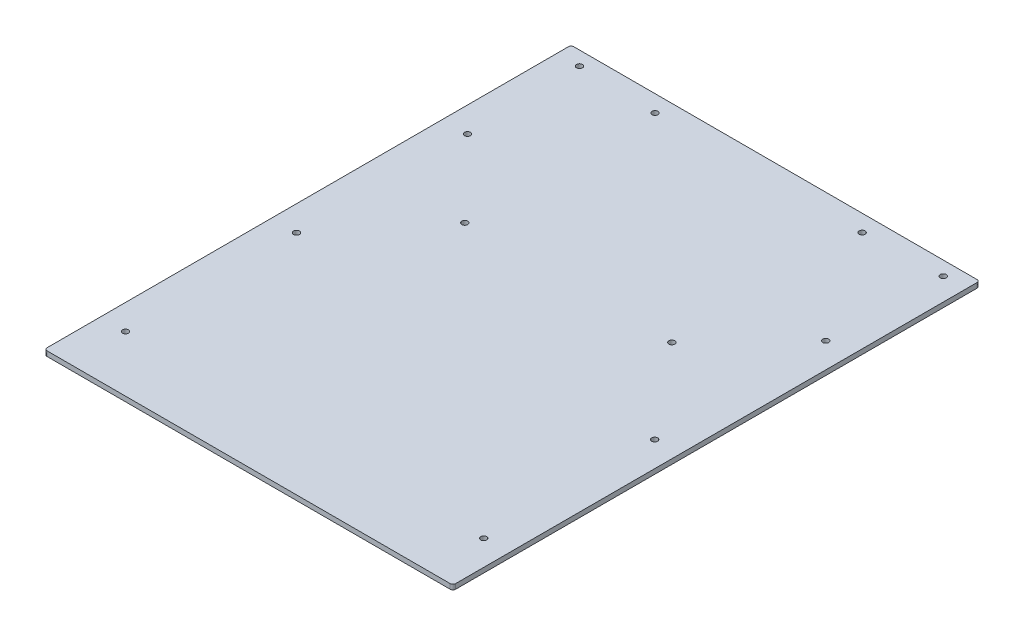
ISO-10303-21;
HEADER;
FILE_DESCRIPTION(('STEP AP214'),'2;1');
FILE_NAME('part.step','',(''),(''),'','','');
FILE_SCHEMA(('AUTOMOTIVE_DESIGN { 1 0 10303 214 1 1 1 1 }'));
ENDSEC;
DATA;
#1=APPLICATION_CONTEXT('core data for automotive mechanical design processes');
#2=APPLICATION_PROTOCOL_DEFINITION('international standard','automotive_design',2000,#1);
#3=PRODUCT_CONTEXT('',#1,'mechanical');
#4=PRODUCT('Part','Part','',(#3));
#5=PRODUCT_RELATED_PRODUCT_CATEGORY('part','',(#4));
#6=PRODUCT_DEFINITION_FORMATION('','',#4);
#7=PRODUCT_DEFINITION_CONTEXT('part definition',#1,'design');
#8=PRODUCT_DEFINITION('design','',#6,#7);
#9=PRODUCT_DEFINITION_SHAPE('','',#8);
#10=(LENGTH_UNIT() NAMED_UNIT(*) SI_UNIT(.MILLI.,.METRE.));
#11=(NAMED_UNIT(*) PLANE_ANGLE_UNIT() SI_UNIT($,.RADIAN.));
#12=(NAMED_UNIT(*) SI_UNIT($,.STERADIAN.) SOLID_ANGLE_UNIT());
#13=UNCERTAINTY_MEASURE_WITH_UNIT(LENGTH_MEASURE(1.E-05),#10,'distance_accuracy_value','');
#14=(GEOMETRIC_REPRESENTATION_CONTEXT(3) GLOBAL_UNCERTAINTY_ASSIGNED_CONTEXT((#13)) GLOBAL_UNIT_ASSIGNED_CONTEXT((#10,
#11,#12)) REPRESENTATION_CONTEXT('',''));
#15=CARTESIAN_POINT('',(0.,0.,0.));
#16=DIRECTION('',(0.,0.,1.));
#17=DIRECTION('',(1.,0.,0.));
#18=AXIS2_PLACEMENT_3D('',#15,#16,#17);
#19=CARTESIAN_POINT('',(0.,5.588,0.));
#20=DIRECTION('',(0.,-1.,0.));
#21=DIRECTION('',(0.,0.,-1.));
#22=AXIS2_PLACEMENT_3D('',#19,#20,#21);
#23=PLANE('',#22);
#24=CARTESIAN_POINT('',(349.25,5.588,-578.612));
#25=DIRECTION('',(0.,1.,0.));
#26=DIRECTION('',(0.,0.,1.));
#27=AXIS2_PLACEMENT_3D('',#24,#25,#26);
#28=CIRCLE('',#27,3.37819999999999);
#29=CARTESIAN_POINT('',(349.25,5.588,-575.2338));
#30=VERTEX_POINT('',#29);
#31=EDGE_CURVE('E243',#30,#30,#28,.T.);
#32=ORIENTED_EDGE('',*,*,#31,.F.);
#33=EDGE_LOOP('',(#32));
#34=FACE_BOUND('',#33,.T.);
#35=CARTESIAN_POINT('',(114.3,5.588,-362.712));
#36=DIRECTION('',(0.,1.,0.));
#37=DIRECTION('',(0.,0.,1.));
#38=AXIS2_PLACEMENT_3D('',#35,#36,#37);
#39=CIRCLE('',#38,3.37819999999999);
#40=CARTESIAN_POINT('',(114.3,5.588,-359.3338));
#41=VERTEX_POINT('',#40);
#42=EDGE_CURVE('E236',#41,#41,#39,.T.);
#43=ORIENTED_EDGE('',*,*,#42,.F.);
#44=EDGE_LOOP('',(#43));
#45=FACE_BOUND('',#44,.T.);
#46=CARTESIAN_POINT('',(349.25,5.588,-362.712));
#47=DIRECTION('',(0.,1.,0.));
#48=DIRECTION('',(0.,0.,1.));
#49=AXIS2_PLACEMENT_3D('',#46,#47,#48);
#50=CIRCLE('',#49,3.37819999999999);
#51=CARTESIAN_POINT('',(349.25,5.588,-359.3338));
#52=VERTEX_POINT('',#51);
#53=EDGE_CURVE('E248',#52,#52,#50,.T.);
#54=ORIENTED_EDGE('',*,*,#53,.F.);
#55=EDGE_LOOP('',(#54));
#56=FACE_BOUND('',#55,.T.);
#57=CARTESIAN_POINT('',(114.3,5.588,-578.612));
#58=DIRECTION('',(0.,1.,0.));
#59=DIRECTION('',(0.,0.,1.));
#60=AXIS2_PLACEMENT_3D('',#57,#58,#59);
#61=CIRCLE('',#60,3.37819999999999);
#62=CARTESIAN_POINT('',(114.3,5.588,-575.2338));
#63=VERTEX_POINT('',#62);
#64=EDGE_CURVE('E230',#63,#63,#61,.T.);
#65=ORIENTED_EDGE('',*,*,#64,.F.);
#66=EDGE_LOOP('',(#65));
#67=FACE_BOUND('',#66,.T.);
#68=CARTESIAN_POINT('',(25.4,5.588,-581.787));
#69=DIRECTION('',(0.,1.,0.));
#70=DIRECTION('',(0.,0.,1.));
#71=AXIS2_PLACEMENT_3D('',#68,#69,#70);
#72=CIRCLE('',#71,3.37819999999999);
#73=CARTESIAN_POINT('',(25.4,5.588,-578.4088));
#74=VERTEX_POINT('',#73);
#75=EDGE_CURVE('E225',#74,#74,#72,.T.);
#76=ORIENTED_EDGE('',*,*,#75,.F.);
#77=EDGE_LOOP('',(#76));
#78=FACE_BOUND('',#77,.T.);
#79=CARTESIAN_POINT('',(438.15,5.588,-581.787));
#80=DIRECTION('',(0.,1.,0.));
#81=DIRECTION('',(0.,0.,-1.));
#82=AXIS2_PLACEMENT_3D('',#79,#80,#81);
#83=CIRCLE('',#82,3.37819999999999);
#84=CARTESIAN_POINT('',(438.15,5.588,-585.1652));
#85=VERTEX_POINT('',#84);
#86=EDGE_CURVE('E218',#85,#85,#83,.T.);
#87=ORIENTED_EDGE('',*,*,#86,.F.);
#88=EDGE_LOOP('',(#87));
#89=FACE_BOUND('',#88,.T.);
#90=DIRECTION('',(-1.,0.,0.));
#91=VECTOR('',#90,1.);
#92=CARTESIAN_POINT('',(0.,5.588,-597.662));
#93=LINE('',#92,#91);
#94=CARTESIAN_POINT('',(460.375,5.588,-597.662));
#95=VERTEX_POINT('',#94);
#96=CARTESIAN_POINT('',(3.175,5.588,-597.662));
#97=VERTEX_POINT('',#96);
#98=EDGE_CURVE('E138',#95,#97,#93,.T.);
#99=ORIENTED_EDGE('',*,*,#98,.T.);
#100=CARTESIAN_POINT('',(3.175,5.588,-594.487));
#101=DIRECTION('',(0.,-1.,0.));
#102=DIRECTION('',(0.,0.,-1.));
#103=AXIS2_PLACEMENT_3D('',#100,#101,#102);
#104=CIRCLE('',#103,3.175);
#105=CARTESIAN_POINT('',(0.,5.588,-594.487));
#106=VERTEX_POINT('',#105);
#107=EDGE_CURVE('E156',#97,#106,#104,.F.);
#108=ORIENTED_EDGE('',*,*,#107,.T.);
#109=DIRECTION('',(0.,0.,1.));
#110=VECTOR('',#109,1.);
#111=CARTESIAN_POINT('',(0.,5.588,0.));
#112=LINE('',#111,#110);
#113=CARTESIAN_POINT('',(0.,5.588,-3.175));
#114=VERTEX_POINT('',#113);
#115=EDGE_CURVE('E120',#106,#114,#112,.T.);
#116=ORIENTED_EDGE('',*,*,#115,.T.);
#117=CARTESIAN_POINT('',(3.175,5.588,-3.175));
#118=DIRECTION('',(0.,-1.,0.));
#119=DIRECTION('',(0.,0.,-1.));
#120=AXIS2_PLACEMENT_3D('',#117,#118,#119);
#121=CIRCLE('',#120,3.175);
#122=CARTESIAN_POINT('',(3.175,5.588,0.));
#123=VERTEX_POINT('',#122);
#124=EDGE_CURVE('E152',#114,#123,#121,.F.);
#125=ORIENTED_EDGE('',*,*,#124,.T.);
#126=DIRECTION('',(1.,0.,0.));
#127=VECTOR('',#126,1.);
#128=CARTESIAN_POINT('',(0.,5.588,0.));
#129=LINE('',#128,#127);
#130=CARTESIAN_POINT('',(460.375,5.588,0.));
#131=VERTEX_POINT('',#130);
#132=EDGE_CURVE('E165',#123,#131,#129,.T.);
#133=ORIENTED_EDGE('',*,*,#132,.T.);
#134=CARTESIAN_POINT('',(460.375,5.588,-3.175));
#135=DIRECTION('',(0.,-1.,0.));
#136=DIRECTION('',(0.,0.,-1.));
#137=AXIS2_PLACEMENT_3D('',#134,#135,#136);
#138=CIRCLE('',#137,3.175);
#139=CARTESIAN_POINT('',(463.55,5.588,-3.175));
#140=VERTEX_POINT('',#139);
#141=EDGE_CURVE('E55',#131,#140,#138,.F.);
#142=ORIENTED_EDGE('',*,*,#141,.T.);
#143=DIRECTION('',(0.,0.,-1.));
#144=VECTOR('',#143,1.);
#145=CARTESIAN_POINT('',(463.55,5.588,0.));
#146=LINE('',#145,#144);
#147=CARTESIAN_POINT('',(463.55,5.588,-594.487));
#148=VERTEX_POINT('',#147);
#149=EDGE_CURVE('E171',#140,#148,#146,.T.);
#150=ORIENTED_EDGE('',*,*,#149,.T.);
#151=CARTESIAN_POINT('',(460.375,5.588,-594.487));
#152=DIRECTION('',(0.,-1.,0.));
#153=DIRECTION('',(0.,0.,-1.));
#154=AXIS2_PLACEMENT_3D('',#151,#152,#153);
#155=CIRCLE('',#154,3.175);
#156=EDGE_CURVE('E154',#148,#95,#155,.F.);
#157=ORIENTED_EDGE('',*,*,#156,.T.);
#158=EDGE_LOOP('',(#99,#108,#116,#125,#133,#142,#150,#157));
#159=FACE_BOUND('',#158,.T.);
#160=CARTESIAN_POINT('',(28.575,5.588,-63.5));
#161=DIRECTION('',(0.,1.,0.));
#162=DIRECTION('',(0.,0.,1.));
#163=AXIS2_PLACEMENT_3D('',#160,#161,#162);
#164=CIRCLE('',#163,3.37820000000001);
#165=CARTESIAN_POINT('',(28.575,5.588,-60.1218));
#166=VERTEX_POINT('',#165);
#167=EDGE_CURVE('E129',#166,#166,#164,.T.);
#168=ORIENTED_EDGE('',*,*,#167,.F.);
#169=EDGE_LOOP('',(#168));
#170=FACE_BOUND('',#169,.T.);
#171=CARTESIAN_POINT('',(28.575,5.588,-257.556));
#172=DIRECTION('',(0.,1.,0.));
#173=DIRECTION('',(0.,0.,1.));
#174=AXIS2_PLACEMENT_3D('',#171,#172,#173);
#175=CIRCLE('',#174,3.37819999999999);
#176=CARTESIAN_POINT('',(28.575,5.588,-254.1778));
#177=VERTEX_POINT('',#176);
#178=EDGE_CURVE('E186',#177,#177,#175,.T.);
#179=ORIENTED_EDGE('',*,*,#178,.F.);
#180=EDGE_LOOP('',(#179));
#181=FACE_BOUND('',#180,.T.);
#182=CARTESIAN_POINT('',(28.575,5.588,-451.612));
#183=DIRECTION('',(0.,1.,0.));
#184=DIRECTION('',(0.,0.,1.));
#185=AXIS2_PLACEMENT_3D('',#182,#183,#184);
#186=CIRCLE('',#185,3.37819999999999);
#187=CARTESIAN_POINT('',(28.575,5.588,-448.2338));
#188=VERTEX_POINT('',#187);
#189=EDGE_CURVE('E191',#188,#188,#186,.T.);
#190=ORIENTED_EDGE('',*,*,#189,.F.);
#191=EDGE_LOOP('',(#190));
#192=FACE_BOUND('',#191,.T.);
#193=CARTESIAN_POINT('',(434.975,5.588,-451.612));
#194=DIRECTION('',(0.,1.,0.));
#195=DIRECTION('',(0.,0.,-1.));
#196=AXIS2_PLACEMENT_3D('',#193,#194,#195);
#197=CIRCLE('',#196,3.37819999999999);
#198=CARTESIAN_POINT('',(434.975,5.588,-454.9902));
#199=VERTEX_POINT('',#198);
#200=EDGE_CURVE('E197',#199,#199,#197,.T.);
#201=ORIENTED_EDGE('',*,*,#200,.F.);
#202=EDGE_LOOP('',(#201));
#203=FACE_BOUND('',#202,.T.);
#204=CARTESIAN_POINT('',(434.975,5.588,-257.556));
#205=DIRECTION('',(0.,1.,0.));
#206=DIRECTION('',(0.,0.,-1.));
#207=AXIS2_PLACEMENT_3D('',#204,#205,#206);
#208=CIRCLE('',#207,3.37819999999999);
#209=CARTESIAN_POINT('',(434.975,5.588,-260.9342));
#210=VERTEX_POINT('',#209);
#211=EDGE_CURVE('E203',#210,#210,#208,.T.);
#212=ORIENTED_EDGE('',*,*,#211,.F.);
#213=EDGE_LOOP('',(#212));
#214=FACE_BOUND('',#213,.T.);
#215=CARTESIAN_POINT('',(434.975,5.588,-63.5000000000001));
#216=DIRECTION('',(0.,1.,0.));
#217=DIRECTION('',(0.,0.,-1.));
#218=AXIS2_PLACEMENT_3D('',#215,#216,#217);
#219=CIRCLE('',#218,3.37819999999999);
#220=CARTESIAN_POINT('',(434.975,5.588,-66.8782));
#221=VERTEX_POINT('',#220);
#222=EDGE_CURVE('E209',#221,#221,#219,.T.);
#223=ORIENTED_EDGE('',*,*,#222,.F.);
#224=EDGE_LOOP('',(#223));
#225=FACE_BOUND('',#224,.T.);
#226=ADVANCED_FACE('F33',(#34,#45,#56,#67,#78,#89,#159,#170,#181,#192,#203,#214,#225),#23,.F.);
#227=CARTESIAN_POINT('',(0.,0.,0.));
#228=DIRECTION('',(0.,-1.,0.));
#229=DIRECTION('',(0.,0.,-1.));
#230=AXIS2_PLACEMENT_3D('',#227,#228,#229);
#231=PLANE('',#230);
#232=CARTESIAN_POINT('',(349.25,0.,-578.612));
#233=DIRECTION('',(0.,1.,0.));
#234=DIRECTION('',(0.,0.,1.));
#235=AXIS2_PLACEMENT_3D('',#232,#233,#234);
#236=CIRCLE('',#235,3.37819999999999);
#237=CARTESIAN_POINT('',(349.25,0.,-575.2338));
#238=VERTEX_POINT('',#237);
#239=EDGE_CURVE('E233',#238,#238,#236,.T.);
#240=ORIENTED_EDGE('',*,*,#239,.T.);
#241=EDGE_LOOP('',(#240));
#242=FACE_BOUND('',#241,.T.);
#243=CARTESIAN_POINT('',(114.3,0.,-362.712));
#244=DIRECTION('',(0.,1.,0.));
#245=DIRECTION('',(0.,0.,1.));
#246=AXIS2_PLACEMENT_3D('',#243,#244,#245);
#247=CIRCLE('',#246,3.37819999999999);
#248=CARTESIAN_POINT('',(114.3,0.,-359.3338));
#249=VERTEX_POINT('',#248);
#250=EDGE_CURVE('E239',#249,#249,#247,.T.);
#251=ORIENTED_EDGE('',*,*,#250,.T.);
#252=EDGE_LOOP('',(#251));
#253=FACE_BOUND('',#252,.T.);
#254=CARTESIAN_POINT('',(349.25,0.,-362.712));
#255=DIRECTION('',(0.,1.,0.));
#256=DIRECTION('',(0.,0.,1.));
#257=AXIS2_PLACEMENT_3D('',#254,#255,#256);
#258=CIRCLE('',#257,3.37819999999999);
#259=CARTESIAN_POINT('',(349.25,0.,-359.3338));
#260=VERTEX_POINT('',#259);
#261=EDGE_CURVE('E240',#260,#260,#258,.T.);
#262=ORIENTED_EDGE('',*,*,#261,.T.);
#263=EDGE_LOOP('',(#262));
#264=FACE_BOUND('',#263,.T.);
#265=CARTESIAN_POINT('',(114.3,0.,-578.612));
#266=DIRECTION('',(0.,1.,0.));
#267=DIRECTION('',(0.,0.,1.));
#268=AXIS2_PLACEMENT_3D('',#265,#266,#267);
#269=CIRCLE('',#268,3.37819999999999);
#270=CARTESIAN_POINT('',(114.3,0.,-575.2338));
#271=VERTEX_POINT('',#270);
#272=EDGE_CURVE('E222',#271,#271,#269,.T.);
#273=ORIENTED_EDGE('',*,*,#272,.T.);
#274=EDGE_LOOP('',(#273));
#275=FACE_BOUND('',#274,.T.);
#276=CARTESIAN_POINT('',(25.4,0.,-581.787));
#277=DIRECTION('',(0.,1.,0.));
#278=DIRECTION('',(0.,0.,1.));
#279=AXIS2_PLACEMENT_3D('',#276,#277,#278);
#280=CIRCLE('',#279,3.37819999999999);
#281=CARTESIAN_POINT('',(25.4,0.,-578.4088));
#282=VERTEX_POINT('',#281);
#283=EDGE_CURVE('E215',#282,#282,#280,.T.);
#284=ORIENTED_EDGE('',*,*,#283,.T.);
#285=EDGE_LOOP('',(#284));
#286=FACE_BOUND('',#285,.T.);
#287=CARTESIAN_POINT('',(438.15,0.,-581.787));
#288=DIRECTION('',(0.,1.,0.));
#289=DIRECTION('',(0.,0.,-1.));
#290=AXIS2_PLACEMENT_3D('',#287,#288,#289);
#291=CIRCLE('',#290,3.37819999999999);
#292=CARTESIAN_POINT('',(438.15,0.,-585.1652));
#293=VERTEX_POINT('',#292);
#294=EDGE_CURVE('E221',#293,#293,#291,.T.);
#295=ORIENTED_EDGE('',*,*,#294,.T.);
#296=EDGE_LOOP('',(#295));
#297=FACE_BOUND('',#296,.T.);
#298=CARTESIAN_POINT('',(434.975,0.,-257.556));
#299=DIRECTION('',(0.,1.,0.));
#300=DIRECTION('',(0.,0.,-1.));
#301=AXIS2_PLACEMENT_3D('',#298,#299,#300);
#302=CIRCLE('',#301,3.37819999999999);
#303=CARTESIAN_POINT('',(434.975,0.,-260.9342));
#304=VERTEX_POINT('',#303);
#305=EDGE_CURVE('E206',#304,#304,#302,.T.);
#306=ORIENTED_EDGE('',*,*,#305,.T.);
#307=EDGE_LOOP('',(#306));
#308=FACE_BOUND('',#307,.T.);
#309=CARTESIAN_POINT('',(28.575,0.,-451.612));
#310=DIRECTION('',(0.,1.,0.));
#311=DIRECTION('',(0.,0.,1.));
#312=AXIS2_PLACEMENT_3D('',#309,#310,#311);
#313=CIRCLE('',#312,3.37819999999999);
#314=CARTESIAN_POINT('',(28.575,0.,-448.2338));
#315=VERTEX_POINT('',#314);
#316=EDGE_CURVE('E194',#315,#315,#313,.T.);
#317=ORIENTED_EDGE('',*,*,#316,.T.);
#318=EDGE_LOOP('',(#317));
#319=FACE_BOUND('',#318,.T.);
#320=CARTESIAN_POINT('',(28.575,0.,-63.5));
#321=DIRECTION('',(0.,1.,0.));
#322=DIRECTION('',(0.,0.,1.));
#323=AXIS2_PLACEMENT_3D('',#320,#321,#322);
#324=CIRCLE('',#323,3.37820000000001);
#325=CARTESIAN_POINT('',(28.575,0.,-60.1218));
#326=VERTEX_POINT('',#325);
#327=EDGE_CURVE('E135',#326,#326,#324,.T.);
#328=ORIENTED_EDGE('',*,*,#327,.T.);
#329=EDGE_LOOP('',(#328));
#330=FACE_BOUND('',#329,.T.);
#331=DIRECTION('',(0.,0.,1.));
#332=VECTOR('',#331,1.);
#333=CARTESIAN_POINT('',(0.,0.,0.));
#334=LINE('',#333,#332);
#335=CARTESIAN_POINT('',(0.,0.,-594.487));
#336=VERTEX_POINT('',#335);
#337=CARTESIAN_POINT('',(0.,0.,-3.175));
#338=VERTEX_POINT('',#337);
#339=EDGE_CURVE('E117',#336,#338,#334,.T.);
#340=ORIENTED_EDGE('',*,*,#339,.F.);
#341=CARTESIAN_POINT('',(3.175,0.,-594.487));
#342=DIRECTION('',(0.,-1.,0.));
#343=DIRECTION('',(0.,0.,-1.));
#344=AXIS2_PLACEMENT_3D('',#341,#342,#343);
#345=CIRCLE('',#344,3.175);
#346=CARTESIAN_POINT('',(3.175,0.,-597.662));
#347=VERTEX_POINT('',#346);
#348=EDGE_CURVE('E100',#336,#347,#345,.T.);
#349=ORIENTED_EDGE('',*,*,#348,.T.);
#350=DIRECTION('',(-1.,0.,0.));
#351=VECTOR('',#350,1.);
#352=CARTESIAN_POINT('',(0.,0.,-597.662));
#353=LINE('',#352,#351);
#354=CARTESIAN_POINT('',(460.375,0.,-597.662));
#355=VERTEX_POINT('',#354);
#356=EDGE_CURVE('E142',#355,#347,#353,.T.);
#357=ORIENTED_EDGE('',*,*,#356,.F.);
#358=CARTESIAN_POINT('',(460.375,0.,-594.487));
#359=DIRECTION('',(0.,-1.,0.));
#360=DIRECTION('',(0.,0.,-1.));
#361=AXIS2_PLACEMENT_3D('',#358,#359,#360);
#362=CIRCLE('',#361,3.175);
#363=CARTESIAN_POINT('',(463.55,0.,-594.487));
#364=VERTEX_POINT('',#363);
#365=EDGE_CURVE('E111',#355,#364,#362,.T.);
#366=ORIENTED_EDGE('',*,*,#365,.T.);
#367=DIRECTION('',(0.,0.,-1.));
#368=VECTOR('',#367,1.);
#369=CARTESIAN_POINT('',(463.55,0.,0.));
#370=LINE('',#369,#368);
#371=CARTESIAN_POINT('',(463.55,0.,-3.175));
#372=VERTEX_POINT('',#371);
#373=EDGE_CURVE('E132',#372,#364,#370,.T.);
#374=ORIENTED_EDGE('',*,*,#373,.F.);
#375=CARTESIAN_POINT('',(460.375,0.,-3.175));
#376=DIRECTION('',(0.,-1.,0.));
#377=DIRECTION('',(0.,0.,-1.));
#378=AXIS2_PLACEMENT_3D('',#375,#376,#377);
#379=CIRCLE('',#378,3.175);
#380=CARTESIAN_POINT('',(460.375,0.,0.));
#381=VERTEX_POINT('',#380);
#382=EDGE_CURVE('E121',#372,#381,#379,.T.);
#383=ORIENTED_EDGE('',*,*,#382,.T.);
#384=DIRECTION('',(1.,0.,0.));
#385=VECTOR('',#384,1.);
#386=CARTESIAN_POINT('',(0.,0.,0.));
#387=LINE('',#386,#385);
#388=CARTESIAN_POINT('',(3.175,0.,0.));
#389=VERTEX_POINT('',#388);
#390=EDGE_CURVE('E128',#389,#381,#387,.T.);
#391=ORIENTED_EDGE('',*,*,#390,.F.);
#392=CARTESIAN_POINT('',(3.175,0.,-3.175));
#393=DIRECTION('',(0.,-1.,0.));
#394=DIRECTION('',(0.,0.,-1.));
#395=AXIS2_PLACEMENT_3D('',#392,#393,#394);
#396=CIRCLE('',#395,3.175);
#397=EDGE_CURVE('E127',#389,#338,#396,.T.);
#398=ORIENTED_EDGE('',*,*,#397,.T.);
#399=EDGE_LOOP('',(#340,#349,#357,#366,#374,#383,#391,#398));
#400=FACE_BOUND('',#399,.T.);
#401=CARTESIAN_POINT('',(28.575,0.,-257.556));
#402=DIRECTION('',(0.,1.,0.));
#403=DIRECTION('',(0.,0.,1.));
#404=AXIS2_PLACEMENT_3D('',#401,#402,#403);
#405=CIRCLE('',#404,3.37819999999999);
#406=CARTESIAN_POINT('',(28.575,0.,-254.1778));
#407=VERTEX_POINT('',#406);
#408=EDGE_CURVE('E188',#407,#407,#405,.T.);
#409=ORIENTED_EDGE('',*,*,#408,.T.);
#410=EDGE_LOOP('',(#409));
#411=FACE_BOUND('',#410,.T.);
#412=CARTESIAN_POINT('',(434.975,0.,-451.612));
#413=DIRECTION('',(0.,1.,0.));
#414=DIRECTION('',(0.,0.,-1.));
#415=AXIS2_PLACEMENT_3D('',#412,#413,#414);
#416=CIRCLE('',#415,3.37819999999999);
#417=CARTESIAN_POINT('',(434.975,0.,-454.9902));
#418=VERTEX_POINT('',#417);
#419=EDGE_CURVE('E200',#418,#418,#416,.T.);
#420=ORIENTED_EDGE('',*,*,#419,.T.);
#421=EDGE_LOOP('',(#420));
#422=FACE_BOUND('',#421,.T.);
#423=CARTESIAN_POINT('',(434.975,0.,-63.5000000000001));
#424=DIRECTION('',(0.,1.,0.));
#425=DIRECTION('',(0.,0.,-1.));
#426=AXIS2_PLACEMENT_3D('',#423,#424,#425);
#427=CIRCLE('',#426,3.37819999999999);
#428=CARTESIAN_POINT('',(434.975,0.,-66.8782));
#429=VERTEX_POINT('',#428);
#430=EDGE_CURVE('E212',#429,#429,#427,.T.);
#431=ORIENTED_EDGE('',*,*,#430,.T.);
#432=EDGE_LOOP('',(#431));
#433=FACE_BOUND('',#432,.T.);
#434=ADVANCED_FACE('F124',(#242,#253,#264,#275,#286,#297,#308,#319,#330,#400,#411,#422,#433),
#231,.T.);
#435=CARTESIAN_POINT('',(0.,5.588,0.));
#436=DIRECTION('',(1.,0.,0.));
#437=DIRECTION('',(0.,0.,-1.));
#438=AXIS2_PLACEMENT_3D('',#435,#436,#437);
#439=PLANE('',#438);
#440=ORIENTED_EDGE('',*,*,#115,.F.);
#441=DIRECTION('',(0.,-1.,0.));
#442=VECTOR('',#441,1.);
#443=CARTESIAN_POINT('',(0.,5.588,-594.487));
#444=LINE('',#443,#442);
#445=EDGE_CURVE('E104',#106,#336,#444,.T.);
#446=ORIENTED_EDGE('',*,*,#445,.T.);
#447=ORIENTED_EDGE('',*,*,#339,.T.);
#448=DIRECTION('',(0.,-1.,0.));
#449=VECTOR('',#448,1.);
#450=CARTESIAN_POINT('',(0.,5.588,-3.175));
#451=LINE('',#450,#449);
#452=EDGE_CURVE('E122',#338,#114,#451,.F.);
#453=ORIENTED_EDGE('',*,*,#452,.T.);
#454=EDGE_LOOP('',(#440,#446,#447,#453));
#455=FACE_BOUND('',#454,.T.);
#456=ADVANCED_FACE('F116',(#455),#439,.F.);
#457=CARTESIAN_POINT('',(0.,5.588,0.));
#458=DIRECTION('',(0.,0.,-1.));
#459=DIRECTION('',(-1.,0.,0.));
#460=AXIS2_PLACEMENT_3D('',#457,#458,#459);
#461=PLANE('',#460);
#462=ORIENTED_EDGE('',*,*,#132,.F.);
#463=DIRECTION('',(0.,-1.,0.));
#464=VECTOR('',#463,1.);
#465=CARTESIAN_POINT('',(3.175,5.588,0.));
#466=LINE('',#465,#464);
#467=EDGE_CURVE('E11',#123,#389,#466,.T.);
#468=ORIENTED_EDGE('',*,*,#467,.T.);
#469=ORIENTED_EDGE('',*,*,#390,.T.);
#470=DIRECTION('',(0.,-1.,0.));
#471=VECTOR('',#470,1.);
#472=CARTESIAN_POINT('',(460.375,5.588,0.));
#473=LINE('',#472,#471);
#474=EDGE_CURVE('E41',#381,#131,#473,.F.);
#475=ORIENTED_EDGE('',*,*,#474,.T.);
#476=EDGE_LOOP('',(#462,#468,#469,#475));
#477=FACE_BOUND('',#476,.T.);
#478=ADVANCED_FACE('F164',(#477),#461,.F.);
#479=CARTESIAN_POINT('',(463.55,5.588,0.));
#480=DIRECTION('',(-1.,0.,0.));
#481=DIRECTION('',(0.,0.,1.));
#482=AXIS2_PLACEMENT_3D('',#479,#480,#481);
#483=PLANE('',#482);
#484=ORIENTED_EDGE('',*,*,#373,.T.);
#485=DIRECTION('',(0.,-1.,0.));
#486=VECTOR('',#485,1.);
#487=CARTESIAN_POINT('',(463.55,5.588,-594.487));
#488=LINE('',#487,#486);
#489=EDGE_CURVE('E48',#364,#148,#488,.F.);
#490=ORIENTED_EDGE('',*,*,#489,.T.);
#491=ORIENTED_EDGE('',*,*,#149,.F.);
#492=DIRECTION('',(0.,-1.,0.));
#493=VECTOR('',#492,1.);
#494=CARTESIAN_POINT('',(463.55,5.588,-3.175));
#495=LINE('',#494,#493);
#496=EDGE_CURVE('E158',#140,#372,#495,.T.);
#497=ORIENTED_EDGE('',*,*,#496,.T.);
#498=EDGE_LOOP('',(#484,#490,#491,#497));
#499=FACE_BOUND('',#498,.T.);
#500=ADVANCED_FACE('F175',(#499),#483,.F.);
#501=CARTESIAN_POINT('',(0.,5.588,-597.662));
#502=DIRECTION('',(0.,0.,1.));
#503=DIRECTION('',(1.,0.,0.));
#504=AXIS2_PLACEMENT_3D('',#501,#502,#503);
#505=PLANE('',#504);
#506=ORIENTED_EDGE('',*,*,#356,.T.);
#507=DIRECTION('',(0.,-1.,0.));
#508=VECTOR('',#507,1.);
#509=CARTESIAN_POINT('',(3.175,5.588,-597.662));
#510=LINE('',#509,#508);
#511=EDGE_CURVE('E105',#347,#97,#510,.F.);
#512=ORIENTED_EDGE('',*,*,#511,.T.);
#513=ORIENTED_EDGE('',*,*,#98,.F.);
#514=DIRECTION('',(0.,-1.,0.));
#515=VECTOR('',#514,1.);
#516=CARTESIAN_POINT('',(460.375,5.588,-597.662));
#517=LINE('',#516,#515);
#518=EDGE_CURVE('E110',#95,#355,#517,.T.);
#519=ORIENTED_EDGE('',*,*,#518,.T.);
#520=EDGE_LOOP('',(#506,#512,#513,#519));
#521=FACE_BOUND('',#520,.T.);
#522=ADVANCED_FACE('F182',(#521),#505,.F.);
#523=CARTESIAN_POINT('',(28.575,5.588,-63.5));
#524=DIRECTION('',(0.,-1.,0.));
#525=DIRECTION('',(0.,0.,-1.));
#526=AXIS2_PLACEMENT_3D('',#523,#524,#525);
#527=CYLINDRICAL_SURFACE('',#526,3.37820000000001);
#528=ORIENTED_EDGE('',*,*,#167,.T.);
#529=EDGE_LOOP('',(#528));
#530=FACE_BOUND('',#529,.T.);
#531=ORIENTED_EDGE('',*,*,#327,.F.);
#532=EDGE_LOOP('',(#531));
#533=FACE_BOUND('',#532,.T.);
#534=ADVANCED_FACE('F308',(#530,#533),#527,.F.);
#535=CARTESIAN_POINT('',(28.575,5.588,-257.556));
#536=DIRECTION('',(0.,-1.,0.));
#537=DIRECTION('',(0.,0.,-1.));
#538=AXIS2_PLACEMENT_3D('',#535,#536,#537);
#539=CYLINDRICAL_SURFACE('',#538,3.37819999999999);
#540=ORIENTED_EDGE('',*,*,#178,.T.);
#541=EDGE_LOOP('',(#540));
#542=FACE_BOUND('',#541,.T.);
#543=ORIENTED_EDGE('',*,*,#408,.F.);
#544=EDGE_LOOP('',(#543));
#545=FACE_BOUND('',#544,.T.);
#546=ADVANCED_FACE('F304',(#542,#545),#539,.F.);
#547=CARTESIAN_POINT('',(28.575,5.588,-451.612));
#548=DIRECTION('',(0.,-1.,0.));
#549=DIRECTION('',(0.,0.,-1.));
#550=AXIS2_PLACEMENT_3D('',#547,#548,#549);
#551=CYLINDRICAL_SURFACE('',#550,3.37819999999999);
#552=ORIENTED_EDGE('',*,*,#189,.T.);
#553=EDGE_LOOP('',(#552));
#554=FACE_BOUND('',#553,.T.);
#555=ORIENTED_EDGE('',*,*,#316,.F.);
#556=EDGE_LOOP('',(#555));
#557=FACE_BOUND('',#556,.T.);
#558=ADVANCED_FACE('F300',(#554,#557),#551,.F.);
#559=CARTESIAN_POINT('',(434.975,5.588,-451.612));
#560=DIRECTION('',(0.,-1.,0.));
#561=DIRECTION('',(0.,0.,-1.));
#562=AXIS2_PLACEMENT_3D('',#559,#560,#561);
#563=CYLINDRICAL_SURFACE('',#562,3.37819999999999);
#564=ORIENTED_EDGE('',*,*,#200,.T.);
#565=EDGE_LOOP('',(#564));
#566=FACE_BOUND('',#565,.T.);
#567=ORIENTED_EDGE('',*,*,#419,.F.);
#568=EDGE_LOOP('',(#567));
#569=FACE_BOUND('',#568,.T.);
#570=ADVANCED_FACE('F296',(#566,#569),#563,.F.);
#571=CARTESIAN_POINT('',(434.975,5.588,-257.556));
#572=DIRECTION('',(0.,-1.,0.));
#573=DIRECTION('',(0.,0.,-1.));
#574=AXIS2_PLACEMENT_3D('',#571,#572,#573);
#575=CYLINDRICAL_SURFACE('',#574,3.37819999999999);
#576=ORIENTED_EDGE('',*,*,#211,.T.);
#577=EDGE_LOOP('',(#576));
#578=FACE_BOUND('',#577,.T.);
#579=ORIENTED_EDGE('',*,*,#305,.F.);
#580=EDGE_LOOP('',(#579));
#581=FACE_BOUND('',#580,.T.);
#582=ADVANCED_FACE('F292',(#578,#581),#575,.F.);
#583=CARTESIAN_POINT('',(434.975,5.588,-63.5000000000001));
#584=DIRECTION('',(0.,-1.,0.));
#585=DIRECTION('',(0.,0.,-1.));
#586=AXIS2_PLACEMENT_3D('',#583,#584,#585);
#587=CYLINDRICAL_SURFACE('',#586,3.37819999999999);
#588=ORIENTED_EDGE('',*,*,#222,.T.);
#589=EDGE_LOOP('',(#588));
#590=FACE_BOUND('',#589,.T.);
#591=ORIENTED_EDGE('',*,*,#430,.F.);
#592=EDGE_LOOP('',(#591));
#593=FACE_BOUND('',#592,.T.);
#594=ADVANCED_FACE('F289',(#590,#593),#587,.F.);
#595=CARTESIAN_POINT('',(3.175,5.588,-594.487));
#596=DIRECTION('',(0.,-1.,0.));
#597=DIRECTION('',(0.,0.,-1.));
#598=AXIS2_PLACEMENT_3D('',#595,#596,#597);
#599=CYLINDRICAL_SURFACE('',#598,3.175);
#600=ORIENTED_EDGE('',*,*,#107,.F.);
#601=ORIENTED_EDGE('',*,*,#511,.F.);
#602=ORIENTED_EDGE('',*,*,#348,.F.);
#603=ORIENTED_EDGE('',*,*,#445,.F.);
#604=EDGE_LOOP('',(#600,#601,#602,#603));
#605=FACE_BOUND('',#604,.T.);
#606=ADVANCED_FACE('F103',(#605),#599,.T.);
#607=CARTESIAN_POINT('',(460.375,5.588,-594.487));
#608=DIRECTION('',(0.,-1.,0.));
#609=DIRECTION('',(0.,0.,-1.));
#610=AXIS2_PLACEMENT_3D('',#607,#608,#609);
#611=CYLINDRICAL_SURFACE('',#610,3.175);
#612=ORIENTED_EDGE('',*,*,#156,.F.);
#613=ORIENTED_EDGE('',*,*,#489,.F.);
#614=ORIENTED_EDGE('',*,*,#365,.F.);
#615=ORIENTED_EDGE('',*,*,#518,.F.);
#616=EDGE_LOOP('',(#612,#613,#614,#615));
#617=FACE_BOUND('',#616,.T.);
#618=ADVANCED_FACE('F179',(#617),#611,.T.);
#619=CARTESIAN_POINT('',(3.175,5.588,-3.175));
#620=DIRECTION('',(0.,-1.,0.));
#621=DIRECTION('',(0.,0.,-1.));
#622=AXIS2_PLACEMENT_3D('',#619,#620,#621);
#623=CYLINDRICAL_SURFACE('',#622,3.175);
#624=ORIENTED_EDGE('',*,*,#124,.F.);
#625=ORIENTED_EDGE('',*,*,#452,.F.);
#626=ORIENTED_EDGE('',*,*,#397,.F.);
#627=ORIENTED_EDGE('',*,*,#467,.F.);
#628=EDGE_LOOP('',(#624,#625,#626,#627));
#629=FACE_BOUND('',#628,.T.);
#630=ADVANCED_FACE('F285',(#629),#623,.T.);
#631=CARTESIAN_POINT('',(460.375,5.588,-3.175));
#632=DIRECTION('',(0.,-1.,0.));
#633=DIRECTION('',(0.,0.,-1.));
#634=AXIS2_PLACEMENT_3D('',#631,#632,#633);
#635=CYLINDRICAL_SURFACE('',#634,3.175);
#636=ORIENTED_EDGE('',*,*,#141,.F.);
#637=ORIENTED_EDGE('',*,*,#474,.F.);
#638=ORIENTED_EDGE('',*,*,#382,.F.);
#639=ORIENTED_EDGE('',*,*,#496,.F.);
#640=EDGE_LOOP('',(#636,#637,#638,#639));
#641=FACE_BOUND('',#640,.T.);
#642=ADVANCED_FACE('F35',(#641),#635,.T.);
#643=CARTESIAN_POINT('',(438.15,0.,-581.787));
#644=DIRECTION('',(0.,1.,0.));
#645=DIRECTION('',(0.,0.,1.));
#646=AXIS2_PLACEMENT_3D('',#643,#644,#645);
#647=CYLINDRICAL_SURFACE('',#646,3.37819999999999);
#648=ORIENTED_EDGE('',*,*,#294,.F.);
#649=EDGE_LOOP('',(#648));
#650=FACE_BOUND('',#649,.T.);
#651=ORIENTED_EDGE('',*,*,#86,.T.);
#652=EDGE_LOOP('',(#651));
#653=FACE_BOUND('',#652,.T.);
#654=ADVANCED_FACE('F274',(#650,#653),#647,.F.);
#655=CARTESIAN_POINT('',(25.4,0.,-581.787));
#656=DIRECTION('',(0.,1.,0.));
#657=DIRECTION('',(0.,0.,1.));
#658=AXIS2_PLACEMENT_3D('',#655,#656,#657);
#659=CYLINDRICAL_SURFACE('',#658,3.37819999999999);
#660=ORIENTED_EDGE('',*,*,#283,.F.);
#661=EDGE_LOOP('',(#660));
#662=FACE_BOUND('',#661,.T.);
#663=ORIENTED_EDGE('',*,*,#75,.T.);
#664=EDGE_LOOP('',(#663));
#665=FACE_BOUND('',#664,.T.);
#666=ADVANCED_FACE('F276',(#662,#665),#659,.F.);
#667=CARTESIAN_POINT('',(114.3,0.,-578.612));
#668=DIRECTION('',(0.,1.,0.));
#669=DIRECTION('',(0.,0.,1.));
#670=AXIS2_PLACEMENT_3D('',#667,#668,#669);
#671=CYLINDRICAL_SURFACE('',#670,3.37819999999999);
#672=ORIENTED_EDGE('',*,*,#272,.F.);
#673=EDGE_LOOP('',(#672));
#674=FACE_BOUND('',#673,.T.);
#675=ORIENTED_EDGE('',*,*,#64,.T.);
#676=EDGE_LOOP('',(#675));
#677=FACE_BOUND('',#676,.T.);
#678=ADVANCED_FACE('F260',(#674,#677),#671,.F.);
#679=CARTESIAN_POINT('',(349.25,0.,-362.712));
#680=DIRECTION('',(0.,1.,0.));
#681=DIRECTION('',(0.,0.,1.));
#682=AXIS2_PLACEMENT_3D('',#679,#680,#681);
#683=CYLINDRICAL_SURFACE('',#682,3.37819999999999);
#684=ORIENTED_EDGE('',*,*,#261,.F.);
#685=EDGE_LOOP('',(#684));
#686=FACE_BOUND('',#685,.T.);
#687=ORIENTED_EDGE('',*,*,#53,.T.);
#688=EDGE_LOOP('',(#687));
#689=FACE_BOUND('',#688,.T.);
#690=ADVANCED_FACE('F256',(#686,#689),#683,.F.);
#691=CARTESIAN_POINT('',(114.3,0.,-362.712));
#692=DIRECTION('',(0.,1.,0.));
#693=DIRECTION('',(0.,0.,1.));
#694=AXIS2_PLACEMENT_3D('',#691,#692,#693);
#695=CYLINDRICAL_SURFACE('',#694,3.37819999999999);
#696=ORIENTED_EDGE('',*,*,#250,.F.);
#697=EDGE_LOOP('',(#696));
#698=FACE_BOUND('',#697,.T.);
#699=ORIENTED_EDGE('',*,*,#42,.T.);
#700=EDGE_LOOP('',(#699));
#701=FACE_BOUND('',#700,.T.);
#702=ADVANCED_FACE('F259',(#698,#701),#695,.F.);
#703=CARTESIAN_POINT('',(349.25,0.,-578.612));
#704=DIRECTION('',(0.,1.,0.));
#705=DIRECTION('',(0.,0.,1.));
#706=AXIS2_PLACEMENT_3D('',#703,#704,#705);
#707=CYLINDRICAL_SURFACE('',#706,3.37819999999999);
#708=ORIENTED_EDGE('',*,*,#239,.F.);
#709=EDGE_LOOP('',(#708));
#710=FACE_BOUND('',#709,.T.);
#711=ORIENTED_EDGE('',*,*,#31,.T.);
#712=EDGE_LOOP('',(#711));
#713=FACE_BOUND('',#712,.T.);
#714=ADVANCED_FACE('F383',(#710,#713),#707,.F.);
#715=CLOSED_SHELL('',(#226,#434,#456,#478,#500,#522,#534,#546,#558,#570,#582,#594,#606,#618,
#630,#642,#654,#666,#678,#690,#702,#714));
#716=MANIFOLD_SOLID_BREP('B2',#715);
#717=ADVANCED_BREP_SHAPE_REPRESENTATION('',(#18,#716),#14);
#718=SHAPE_DEFINITION_REPRESENTATION(#9,#717);
ENDSEC;
END-ISO-10303-21;
